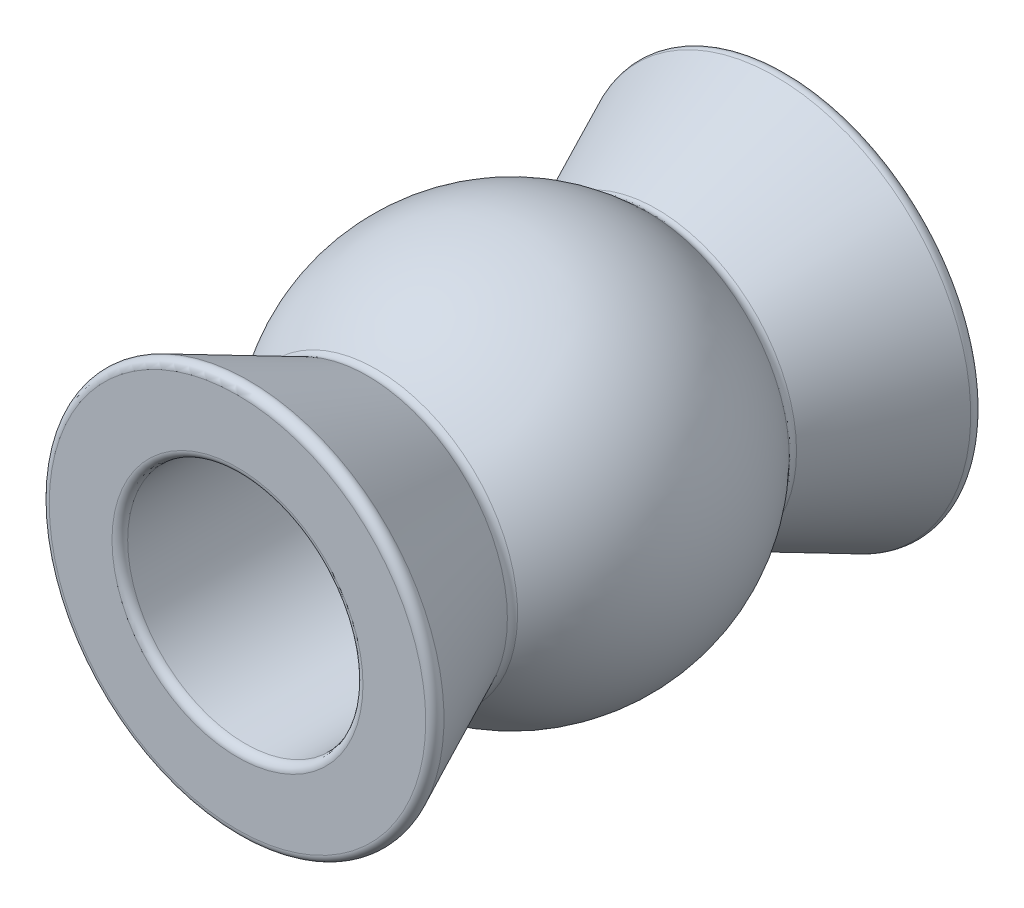
ISO-10303-21;
HEADER;
FILE_DESCRIPTION(('STEP AP214'),'2;1');
FILE_NAME('part.step','',(''),(''),'','','');
FILE_SCHEMA(('AUTOMOTIVE_DESIGN { 1 0 10303 214 1 1 1 1 }'));
ENDSEC;
DATA;
#1=APPLICATION_CONTEXT('core data for automotive mechanical design processes');
#2=APPLICATION_PROTOCOL_DEFINITION('international standard','automotive_design',2000,#1);
#3=PRODUCT_CONTEXT('',#1,'mechanical');
#4=PRODUCT('Part','Part','',(#3));
#5=PRODUCT_RELATED_PRODUCT_CATEGORY('part','',(#4));
#6=PRODUCT_DEFINITION_FORMATION('','',#4);
#7=PRODUCT_DEFINITION_CONTEXT('part definition',#1,'design');
#8=PRODUCT_DEFINITION('design','',#6,#7);
#9=PRODUCT_DEFINITION_SHAPE('','',#8);
#10=(LENGTH_UNIT() NAMED_UNIT(*) SI_UNIT(.MILLI.,.METRE.));
#11=(NAMED_UNIT(*) PLANE_ANGLE_UNIT() SI_UNIT($,.RADIAN.));
#12=(NAMED_UNIT(*) SI_UNIT($,.STERADIAN.) SOLID_ANGLE_UNIT());
#13=UNCERTAINTY_MEASURE_WITH_UNIT(LENGTH_MEASURE(1.E-05),#10,'distance_accuracy_value','');
#14=(GEOMETRIC_REPRESENTATION_CONTEXT(3) GLOBAL_UNCERTAINTY_ASSIGNED_CONTEXT((#13)) GLOBAL_UNIT_ASSIGNED_CONTEXT((#10,
#11,#12)) REPRESENTATION_CONTEXT('',''));
#15=CARTESIAN_POINT('',(0.,0.,0.));
#16=DIRECTION('',(0.,0.,1.));
#17=DIRECTION('',(1.,0.,0.));
#18=AXIS2_PLACEMENT_3D('',#15,#16,#17);
#19=CARTESIAN_POINT('',(0.,0.,1.80110986204247));
#20=DIRECTION('',(0.,0.,-1.));
#21=DIRECTION('',(-1.,0.,0.));
#22=AXIS2_PLACEMENT_3D('',#19,#20,#21);
#23=TOROIDAL_SURFACE('',#22,1.87510086791441,0.0999999999999998);
#24=CARTESIAN_POINT('',(0.,0.,1.84337168821654));
#25=DIRECTION('',(0.,0.,-1.));
#26=DIRECTION('',(-1.,0.,0.));
#27=AXIS2_PLACEMENT_3D('',#24,#25,#26);
#28=CIRCLE('',#27,1.78447008921074);
#29=CARTESIAN_POINT('',(-1.78447008921074,0.,1.84337168821654));
#30=VERTEX_POINT('',#29);
#31=EDGE_CURVE('E10',#30,#30,#28,.T.);
#32=ORIENTED_EDGE('',*,*,#31,.T.);
#33=EDGE_LOOP('',(#32));
#34=FACE_BOUND('',#33,.T.);
#35=CARTESIAN_POINT('',(0.,0.,1.73183640581007));
#36=DIRECTION('',(0.,0.,-1.));
#37=DIRECTION('',(-1.,0.,0.));
#38=AXIS2_PLACEMENT_3D('',#35,#36,#37);
#39=CIRCLE('',#38,1.80298160376385);
#40=CARTESIAN_POINT('',(0.,1.80298160376385,1.73183640581007));
#41=VERTEX_POINT('',#40);
#42=EDGE_CURVE('E90',#41,#41,#39,.T.);
#43=ORIENTED_EDGE('',*,*,#42,.F.);
#44=EDGE_LOOP('',(#43));
#45=FACE_BOUND('',#44,.T.);
#46=ADVANCED_FACE('F39',(#34,#45),#23,.F.);
#47=CARTESIAN_POINT('',(0.,0.,1.84337168821654));
#48=DIRECTION('',(0.,0.,1.));
#49=DIRECTION('',(1.,0.,0.));
#50=AXIS2_PLACEMENT_3D('',#47,#48,#49);
#51=CONICAL_SURFACE('',#50,1.78447008921074,0.43633231299858);
#52=CARTESIAN_POINT('',(0.,0.,3.35773817382593));
#53=DIRECTION('',(0.,0.,-1.));
#54=DIRECTION('',(-1.,0.,0.));
#55=AXIS2_PLACEMENT_3D('',#52,#53,#54);
#56=CIRCLE('',#55,2.49063077870367);
#57=CARTESIAN_POINT('',(-2.49063077870367,0.,3.35773817382593));
#58=VERTEX_POINT('',#57);
#59=EDGE_CURVE('E46',#58,#58,#56,.T.);
#60=ORIENTED_EDGE('',*,*,#59,.T.);
#61=EDGE_LOOP('',(#60));
#62=FACE_BOUND('',#61,.T.);
#63=ORIENTED_EDGE('',*,*,#31,.F.);
#64=EDGE_LOOP('',(#63));
#65=FACE_BOUND('',#64,.T.);
#66=ADVANCED_FACE('F99',(#62,#65),#51,.T.);
#67=CARTESIAN_POINT('',(0.,0.,3.4));
#68=DIRECTION('',(0.,0.,-1.));
#69=DIRECTION('',(-1.,0.,0.));
#70=AXIS2_PLACEMENT_3D('',#67,#68,#69);
#71=TOROIDAL_SURFACE('',#70,2.4,0.0999999999999995);
#72=CARTESIAN_POINT('',(0.,0.,3.5));
#73=DIRECTION('',(0.,0.,-1.));
#74=DIRECTION('',(-1.,0.,0.));
#75=AXIS2_PLACEMENT_3D('',#72,#73,#74);
#76=CIRCLE('',#75,2.4);
#77=CARTESIAN_POINT('',(-2.4,0.,3.5));
#78=VERTEX_POINT('',#77);
#79=EDGE_CURVE('E51',#78,#78,#76,.T.);
#80=ORIENTED_EDGE('',*,*,#79,.T.);
#81=EDGE_LOOP('',(#80));
#82=FACE_BOUND('',#81,.T.);
#83=ORIENTED_EDGE('',*,*,#59,.F.);
#84=EDGE_LOOP('',(#83));
#85=FACE_BOUND('',#84,.T.);
#86=ADVANCED_FACE('F103',(#82,#85),#71,.T.);
#87=CARTESIAN_POINT('',(0.,2.4,3.5));
#88=DIRECTION('',(0.,0.,1.));
#89=DIRECTION('',(1.,0.,0.));
#90=AXIS2_PLACEMENT_3D('',#87,#88,#89);
#91=PLANE('',#90);
#92=CARTESIAN_POINT('',(0.,0.,3.5));
#93=DIRECTION('',(0.,0.,-1.));
#94=DIRECTION('',(-1.,0.,0.));
#95=AXIS2_PLACEMENT_3D('',#92,#93,#94);
#96=CIRCLE('',#95,1.6);
#97=CARTESIAN_POINT('',(-1.6,0.,3.5));
#98=VERTEX_POINT('',#97);
#99=EDGE_CURVE('E56',#98,#98,#96,.T.);
#100=ORIENTED_EDGE('',*,*,#99,.T.);
#101=EDGE_LOOP('',(#100));
#102=FACE_BOUND('',#101,.T.);
#103=ORIENTED_EDGE('',*,*,#79,.F.);
#104=EDGE_LOOP('',(#103));
#105=FACE_BOUND('',#104,.T.);
#106=ADVANCED_FACE('F107',(#102,#105),#91,.T.);
#107=CARTESIAN_POINT('',(0.,0.,3.4));
#108=DIRECTION('',(0.,0.,-1.));
#109=DIRECTION('',(-1.,0.,0.));
#110=AXIS2_PLACEMENT_3D('',#107,#108,#109);
#111=TOROIDAL_SURFACE('',#110,1.6,0.1);
#112=CARTESIAN_POINT('',(0.,0.,3.4));
#113=DIRECTION('',(0.,0.,-1.));
#114=DIRECTION('',(-1.,0.,0.));
#115=AXIS2_PLACEMENT_3D('',#112,#113,#114);
#116=CIRCLE('',#115,1.5);
#117=CARTESIAN_POINT('',(-1.5,0.,3.4));
#118=VERTEX_POINT('',#117);
#119=EDGE_CURVE('E62',#118,#118,#116,.T.);
#120=ORIENTED_EDGE('',*,*,#119,.T.);
#121=EDGE_LOOP('',(#120));
#122=FACE_BOUND('',#121,.T.);
#123=ORIENTED_EDGE('',*,*,#99,.F.);
#124=EDGE_LOOP('',(#123));
#125=FACE_BOUND('',#124,.T.);
#126=ADVANCED_FACE('F114',(#122,#125),#111,.T.);
#127=CARTESIAN_POINT('',(0.,0.,0.));
#128=DIRECTION('',(0.,0.,-1.));
#129=DIRECTION('',(-1.,0.,0.));
#130=AXIS2_PLACEMENT_3D('',#127,#128,#129);
#131=CYLINDRICAL_SURFACE('',#130,1.5);
#132=CARTESIAN_POINT('',(0.,0.,-3.4));
#133=DIRECTION('',(0.,0.,-1.));
#134=DIRECTION('',(-1.,0.,0.));
#135=AXIS2_PLACEMENT_3D('',#132,#133,#134);
#136=CIRCLE('',#135,1.5);
#137=CARTESIAN_POINT('',(-1.5,0.,-3.4));
#138=VERTEX_POINT('',#137);
#139=EDGE_CURVE('E66',#138,#138,#136,.T.);
#140=ORIENTED_EDGE('',*,*,#139,.T.);
#141=EDGE_LOOP('',(#140));
#142=FACE_BOUND('',#141,.T.);
#143=ORIENTED_EDGE('',*,*,#119,.F.);
#144=EDGE_LOOP('',(#143));
#145=FACE_BOUND('',#144,.T.);
#146=ADVANCED_FACE('F118',(#142,#145),#131,.F.);
#147=CARTESIAN_POINT('',(0.,0.,-3.4));
#148=DIRECTION('',(0.,0.,-1.));
#149=DIRECTION('',(-1.,0.,0.));
#150=AXIS2_PLACEMENT_3D('',#147,#148,#149);
#151=TOROIDAL_SURFACE('',#150,1.6,0.1);
#152=CARTESIAN_POINT('',(0.,0.,-3.5));
#153=DIRECTION('',(0.,0.,-1.));
#154=DIRECTION('',(-1.,0.,0.));
#155=AXIS2_PLACEMENT_3D('',#152,#153,#154);
#156=CIRCLE('',#155,1.6);
#157=CARTESIAN_POINT('',(-1.6,0.,-3.5));
#158=VERTEX_POINT('',#157);
#159=EDGE_CURVE('E70',#158,#158,#156,.T.);
#160=ORIENTED_EDGE('',*,*,#159,.T.);
#161=EDGE_LOOP('',(#160));
#162=FACE_BOUND('',#161,.T.);
#163=ORIENTED_EDGE('',*,*,#139,.F.);
#164=EDGE_LOOP('',(#163));
#165=FACE_BOUND('',#164,.T.);
#166=ADVANCED_FACE('F122',(#162,#165),#151,.T.);
#167=CARTESIAN_POINT('',(0.,2.4,-3.5));
#168=DIRECTION('',(0.,0.,-1.));
#169=DIRECTION('',(-1.,0.,0.));
#170=AXIS2_PLACEMENT_3D('',#167,#168,#169);
#171=PLANE('',#170);
#172=CARTESIAN_POINT('',(0.,0.,-3.5));
#173=DIRECTION('',(0.,0.,-1.));
#174=DIRECTION('',(-1.,0.,0.));
#175=AXIS2_PLACEMENT_3D('',#172,#173,#174);
#176=CIRCLE('',#175,2.4);
#177=CARTESIAN_POINT('',(-2.4,0.,-3.5));
#178=VERTEX_POINT('',#177);
#179=EDGE_CURVE('E74',#178,#178,#176,.T.);
#180=ORIENTED_EDGE('',*,*,#179,.T.);
#181=EDGE_LOOP('',(#180));
#182=FACE_BOUND('',#181,.T.);
#183=ORIENTED_EDGE('',*,*,#159,.F.);
#184=EDGE_LOOP('',(#183));
#185=FACE_BOUND('',#184,.T.);
#186=ADVANCED_FACE('F126',(#182,#185),#171,.T.);
#187=CARTESIAN_POINT('',(0.,0.,-3.4));
#188=DIRECTION('',(0.,0.,-1.));
#189=DIRECTION('',(-1.,0.,0.));
#190=AXIS2_PLACEMENT_3D('',#187,#188,#189);
#191=TOROIDAL_SURFACE('',#190,2.4,0.0999999999999995);
#192=CARTESIAN_POINT('',(0.,0.,-3.35773817382593));
#193=DIRECTION('',(0.,0.,-1.));
#194=DIRECTION('',(-1.,0.,0.));
#195=AXIS2_PLACEMENT_3D('',#192,#193,#194);
#196=CIRCLE('',#195,2.49063077870366);
#197=CARTESIAN_POINT('',(-2.49063077870366,0.,-3.35773817382593));
#198=VERTEX_POINT('',#197);
#199=EDGE_CURVE('E78',#198,#198,#196,.T.);
#200=ORIENTED_EDGE('',*,*,#199,.T.);
#201=EDGE_LOOP('',(#200));
#202=FACE_BOUND('',#201,.T.);
#203=ORIENTED_EDGE('',*,*,#179,.F.);
#204=EDGE_LOOP('',(#203));
#205=FACE_BOUND('',#204,.T.);
#206=ADVANCED_FACE('F130',(#202,#205),#191,.T.);
#207=CARTESIAN_POINT('',(0.,0.,-3.35773817382593));
#208=DIRECTION('',(0.,0.,-1.));
#209=DIRECTION('',(-1.,0.,0.));
#210=AXIS2_PLACEMENT_3D('',#207,#208,#209);
#211=CONICAL_SURFACE('',#210,2.49063077870366,0.436332312998579);
#212=CARTESIAN_POINT('',(0.,0.,-1.84337168821654));
#213=DIRECTION('',(0.,0.,-1.));
#214=DIRECTION('',(-1.,0.,0.));
#215=AXIS2_PLACEMENT_3D('',#212,#213,#214);
#216=CIRCLE('',#215,1.78447008921074);
#217=CARTESIAN_POINT('',(-1.78447008921074,0.,-1.84337168821654));
#218=VERTEX_POINT('',#217);
#219=EDGE_CURVE('E82',#218,#218,#216,.T.);
#220=ORIENTED_EDGE('',*,*,#219,.T.);
#221=EDGE_LOOP('',(#220));
#222=FACE_BOUND('',#221,.T.);
#223=ORIENTED_EDGE('',*,*,#199,.F.);
#224=EDGE_LOOP('',(#223));
#225=FACE_BOUND('',#224,.T.);
#226=ADVANCED_FACE('F134',(#222,#225),#211,.T.);
#227=CARTESIAN_POINT('',(0.,0.,-1.80110986204247));
#228=DIRECTION('',(0.,0.,-1.));
#229=DIRECTION('',(-1.,0.,0.));
#230=AXIS2_PLACEMENT_3D('',#227,#228,#229);
#231=TOROIDAL_SURFACE('',#230,1.87510086791441,0.0999999999999998);
#232=CARTESIAN_POINT('',(0.,0.,-1.73183640581007));
#233=DIRECTION('',(0.,0.,-1.));
#234=DIRECTION('',(-1.,0.,0.));
#235=AXIS2_PLACEMENT_3D('',#232,#233,#234);
#236=CIRCLE('',#235,1.80298160376385);
#237=CARTESIAN_POINT('',(0.,1.80298160376385,-1.73183640581007));
#238=VERTEX_POINT('',#237);
#239=EDGE_CURVE('E86',#238,#238,#236,.T.);
#240=ORIENTED_EDGE('',*,*,#239,.T.);
#241=EDGE_LOOP('',(#240));
#242=FACE_BOUND('',#241,.T.);
#243=ORIENTED_EDGE('',*,*,#219,.F.);
#244=EDGE_LOOP('',(#243));
#245=FACE_BOUND('',#244,.T.);
#246=ADVANCED_FACE('F138',(#242,#245),#231,.F.);
#247=CARTESIAN_POINT('',(0.,0.,0.));
#248=DIRECTION('',(0.,0.,-1.));
#249=DIRECTION('',(0.,1.,0.));
#250=AXIS2_PLACEMENT_3D('',#247,#248,#249);
#251=SPHERICAL_SURFACE('',#250,2.5);
#252=CARTESIAN_POINT('',(0.,1.80298160376385,1.73183640581007));
#253=CARTESIAN_POINT('',(0.,1.83059321817555,1.70309161376191));
#254=CARTESIAN_POINT('',(0.,1.85751624096922,1.67368549166604));
#255=CARTESIAN_POINT('',(0.,1.90992611469463,1.61362010665456));
#256=CARTESIAN_POINT('',(0.,1.93541296562636,1.58296084373895));
#257=CARTESIAN_POINT('',(0.,1.98489150700195,1.52045869636362));
#258=CARTESIAN_POINT('',(0.,2.00888319744581,1.48861581190392));
#259=CARTESIAN_POINT('',(0.,2.05531672918199,1.42381941594212));
#260=CARTESIAN_POINT('',(0.,2.0777585704743,1.39086590444003));
#261=CARTESIAN_POINT('',(0.,2.12104102427238,1.32392358337575));
#262=CARTESIAN_POINT('',(0.,2.14188163677815,1.28993477381356));
#263=CARTESIAN_POINT('',(0.,2.18191397895072,1.22099960872291));
#264=CARTESIAN_POINT('',(0.,2.20110570861751,1.18605325319445));
#265=CARTESIAN_POINT('',(0.,2.23779638551175,1.11528292362431));
#266=CARTESIAN_POINT('',(0.,2.2552953327392,1.07945894958262));
#267=CARTESIAN_POINT('',(0.,2.28856042148504,1.00701532171892));
#268=CARTESIAN_POINT('',(0.,2.30432656300343,0.970395667896902));
#269=CARTESIAN_POINT('',(0.,2.33408997918198,0.896444438052385));
#270=CARTESIAN_POINT('',(0.,2.34808725384214,0.859112862029887));
#271=CARTESIAN_POINT('',(0.,2.3742809212974,0.783823173982843));
#272=CARTESIAN_POINT('',(0.,2.38647731409251,0.745865061958297));
#273=CARTESIAN_POINT('',(0.,2.40904132176605,0.669409121065363));
#274=CARTESIAN_POINT('',(0.,2.41940893664449,0.630911292196974));
#275=CARTESIAN_POINT('',(0.,2.43829167530384,0.553463971254957));
#276=CARTESIAN_POINT('',(0.,2.44680679908475,0.51451447918133));
#277=CARTESIAN_POINT('',(0.,2.46196507944694,0.436252918522481));
#278=CARTESIAN_POINT('',(0.,2.46860823602821,0.39694084993726));
#279=CARTESIAN_POINT('',(0.,2.48000738752212,0.31804405224852));
#280=CARTESIAN_POINT('',(0.,2.48476338243477,0.278459323145));
#281=CARTESIAN_POINT('',(0.,2.49237733250681,0.199107744051618));
#282=CARTESIAN_POINT('',(0.,2.49523528766621,0.159340894061755));
#283=CARTESIAN_POINT('',(0.,2.49904662141281,0.0797160293812615));
#284=CARTESIAN_POINT('',(0.,2.5,0.0398580146906309));
#285=CARTESIAN_POINT('',(0.,2.5,-0.0398580146906303));
#286=CARTESIAN_POINT('',(0.,2.49904662141281,-0.079716029381261));
#287=CARTESIAN_POINT('',(0.,2.49523528766621,-0.159340894061754));
#288=CARTESIAN_POINT('',(0.,2.49237733250681,-0.199107744051617));
#289=CARTESIAN_POINT('',(0.,2.48476338243477,-0.278459323144999));
#290=CARTESIAN_POINT('',(0.,2.48000738752212,-0.318044052248519));
#291=CARTESIAN_POINT('',(0.,2.46860823602821,-0.396940849937259));
#292=CARTESIAN_POINT('',(0.,2.46196507944694,-0.43625291852248));
#293=CARTESIAN_POINT('',(0.,2.44680679908475,-0.514514479181329));
#294=CARTESIAN_POINT('',(0.,2.43829167530384,-0.553463971254957));
#295=CARTESIAN_POINT('',(0.,2.41940893664449,-0.630911292196974));
#296=CARTESIAN_POINT('',(0.,2.40904132176605,-0.669409121065362));
#297=CARTESIAN_POINT('',(0.,2.38647731409251,-0.745865061958297));
#298=CARTESIAN_POINT('',(0.,2.3742809212974,-0.783823173982842));
#299=CARTESIAN_POINT('',(0.,2.34808725384214,-0.859112862029886));
#300=CARTESIAN_POINT('',(0.,2.33408997918198,-0.896444438052385));
#301=CARTESIAN_POINT('',(0.,2.30432656300343,-0.970395667896901));
#302=CARTESIAN_POINT('',(0.,2.28856042148504,-1.00701532171892));
#303=CARTESIAN_POINT('',(0.,2.2552953327392,-1.07945894958262));
#304=CARTESIAN_POINT('',(0.,2.23779638551175,-1.11528292362431));
#305=CARTESIAN_POINT('',(0.,2.20110570861751,-1.18605325319445));
#306=CARTESIAN_POINT('',(0.,2.18191397895072,-1.22099960872291));
#307=CARTESIAN_POINT('',(0.,2.14188163677815,-1.28993477381356));
#308=CARTESIAN_POINT('',(0.,2.12104102427238,-1.32392358337575));
#309=CARTESIAN_POINT('',(0.,2.0777585704743,-1.39086590444003));
#310=CARTESIAN_POINT('',(0.,2.05531672918199,-1.42381941594212));
#311=CARTESIAN_POINT('',(0.,2.00888319744581,-1.48861581190392));
#312=CARTESIAN_POINT('',(0.,1.98489150700195,-1.52045869636362));
#313=CARTESIAN_POINT('',(0.,1.93541296562636,-1.58296084373895));
#314=CARTESIAN_POINT('',(0.,1.90992611469463,-1.61362010665456));
#315=CARTESIAN_POINT('',(0.,1.85751624096922,-1.67368549166604));
#316=CARTESIAN_POINT('',(0.,1.83059321817555,-1.70309161376191));
#317=CARTESIAN_POINT('',(0.,1.80298160376385,-1.73183640581007));
#318=B_SPLINE_CURVE_WITH_KNOTS('',3,(#252,#253,#254,#255,#256,#257,#258,#259,#260,#261,#262,
#263,#264,#265,#266,#267,#268,#269,#270,#271,#272,#273,#274,#275,#276,#277,#278,#279,#280,#281,
#282,#283,#284,#285,#286,#287,#288,#289,#290,#291,#292,#293,#294,#295,#296,#297,#298,#299,#300,
#301,#302,#303,#304,#305,#306,#307,#308,#309,#310,#311,#312,#313,#314,#315,#316,#317),
.UNSPECIFIED.,.F.,.F.,(4,2,2,2,2,2,2,2,2,2,2,2,2,2,2,2,2,2,2,2,2,2,2,2,2,2,2,2,2,2,2,2,4),(0.,
0.11956265011472,0.239125300229441,0.358687950344162,0.478250600458883,0.597813250573604,
0.717375900688325,0.836938550803045,0.956501200917766,1.07606385103249,1.19562650114721,
1.31518915126193,1.43475180137665,1.55431445149137,1.67387710160609,1.79343975172081,
1.91300240183553,2.03256505195025,2.15212770206497,2.27169035217969,2.39125300229442,
2.51081565240914,2.63037830252386,2.74994095263858,2.8695036027533,2.98906625286802,
3.10862890298274,3.22819155309746,3.34775420321218,3.4673168533269,3.58687950344162,
3.70644215355634,3.82600480367106),.UNSPECIFIED.);
#319=EDGE_CURVE('BSEAM95',#41,#238,#318,.T.);
#320=ORIENTED_EDGE('',*,*,#42,.T.);
#321=ORIENTED_EDGE('',*,*,#239,.F.);
#322=ORIENTED_EDGE('',*,*,#319,.T.);
#323=ORIENTED_EDGE('',*,*,#319,.F.);
#324=EDGE_LOOP('',(#320,#322,#321,#323));
#325=FACE_BOUND('',#324,.T.);
#326=ADVANCED_FACE('F95',(#325),#251,.T.);
#327=CLOSED_SHELL('',(#46,#66,#86,#106,#126,#146,#166,#186,#206,#226,#246,#326));
#328=MANIFOLD_SOLID_BREP('B2',#327);
#329=ADVANCED_BREP_SHAPE_REPRESENTATION('',(#18,#328),#14);
#330=SHAPE_DEFINITION_REPRESENTATION(#9,#329);
ENDSEC;
END-ISO-10303-21;
